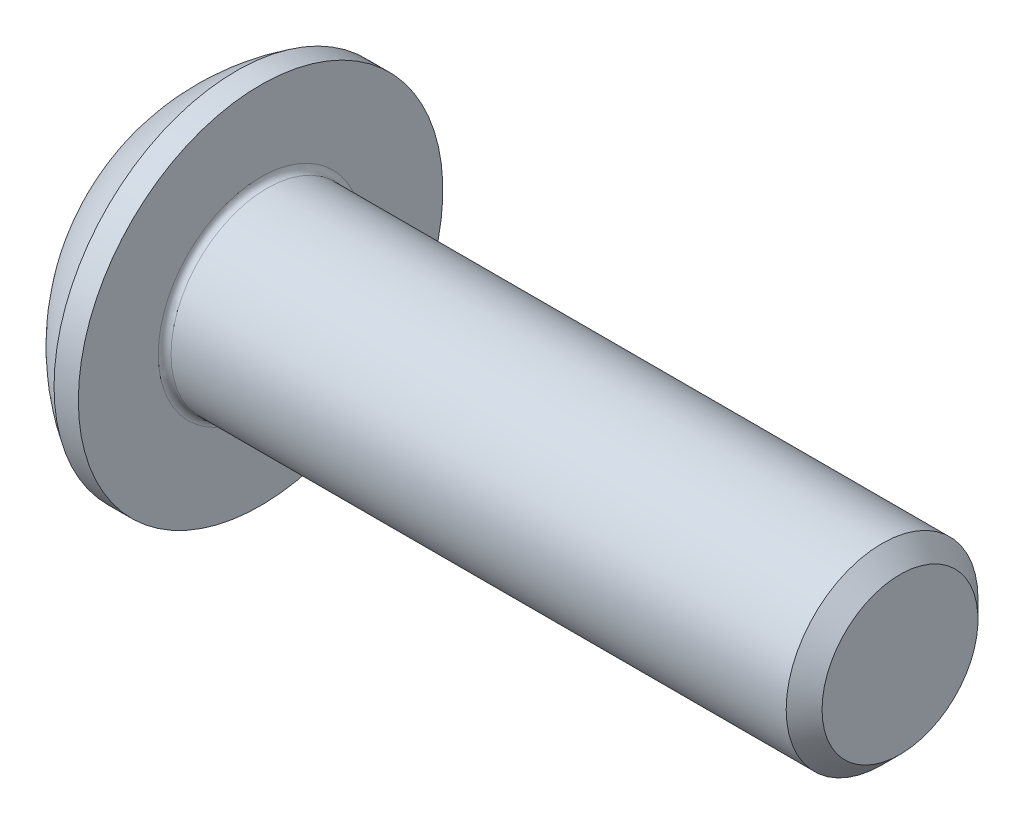
ISO-10303-21;
HEADER;
FILE_DESCRIPTION(('STEP AP214'),'2;1');
FILE_NAME('part.step','',(''),(''),'','','');
FILE_SCHEMA(('AUTOMOTIVE_DESIGN { 1 0 10303 214 1 1 1 1 }'));
ENDSEC;
DATA;
#1=APPLICATION_CONTEXT('core data for automotive mechanical design processes');
#2=APPLICATION_PROTOCOL_DEFINITION('international standard','automotive_design',2000,#1);
#3=PRODUCT_CONTEXT('',#1,'mechanical');
#4=PRODUCT('Part','Part','',(#3));
#5=PRODUCT_RELATED_PRODUCT_CATEGORY('part','',(#4));
#6=PRODUCT_DEFINITION_FORMATION('','',#4);
#7=PRODUCT_DEFINITION_CONTEXT('part definition',#1,'design');
#8=PRODUCT_DEFINITION('design','',#6,#7);
#9=PRODUCT_DEFINITION_SHAPE('','',#8);
#10=(LENGTH_UNIT() NAMED_UNIT(*) SI_UNIT(.MILLI.,.METRE.));
#11=(NAMED_UNIT(*) PLANE_ANGLE_UNIT() SI_UNIT($,.RADIAN.));
#12=(NAMED_UNIT(*) SI_UNIT($,.STERADIAN.) SOLID_ANGLE_UNIT());
#13=UNCERTAINTY_MEASURE_WITH_UNIT(LENGTH_MEASURE(1.E-05),#10,'distance_accuracy_value','');
#14=(GEOMETRIC_REPRESENTATION_CONTEXT(3) GLOBAL_UNCERTAINTY_ASSIGNED_CONTEXT((#13)) GLOBAL_UNIT_ASSIGNED_CONTEXT((#10,
#11,#12)) REPRESENTATION_CONTEXT('',''));
#15=CARTESIAN_POINT('',(0.,0.,0.));
#16=DIRECTION('',(0.,0.,1.));
#17=DIRECTION('',(1.,0.,0.));
#18=AXIS2_PLACEMENT_3D('',#15,#16,#17);
#19=CARTESIAN_POINT('',(1.03999999993221,0.,0.));
#20=DIRECTION('',(-1.,0.,0.));
#21=DIRECTION('',(0.,0.,1.));
#22=AXIS2_PLACEMENT_3D('',#19,#20,#21);
#23=CONICAL_SURFACE('',#22,1.0000000000332,1.04719755017927);
#24=CARTESIAN_POINT('',(1.61735027052146,0.,0.));
#25=VERTEX_POINT('',#24);
#26=VERTEX_LOOP('',#25);
#27=FACE_BOUND('',#26,.T.);
#28=CARTESIAN_POINT('',(1.03999999993221,0.,0.));
#29=DIRECTION('',(-1.,0.,0.));
#30=DIRECTION('',(0.,0.,1.));
#31=AXIS2_PLACEMENT_3D('',#28,#29,#30);
#32=CIRCLE('',#31,1.0000000000332);
#33=CARTESIAN_POINT('',(1.03999999995577,0.866025403798815,-0.500000000008298));
#34=VERTEX_POINT('',#33);
#35=CARTESIAN_POINT('',(1.0399999999611,0.,-0.999999999996476));
#36=VERTEX_POINT('',#35);
#37=EDGE_CURVE('E240',#34,#36,#32,.T.);
#38=ORIENTED_EDGE('',*,*,#37,.T.);
#39=CARTESIAN_POINT('',(1.03999999993221,0.,0.));
#40=DIRECTION('',(-1.,0.,0.));
#41=DIRECTION('',(0.,0.,1.));
#42=AXIS2_PLACEMENT_3D('',#39,#40,#41);
#43=CIRCLE('',#42,1.0000000000332);
#44=CARTESIAN_POINT('',(1.03999999995577,-0.866025403798814,-0.500000000008297));
#45=VERTEX_POINT('',#44);
#46=EDGE_CURVE('E220',#36,#45,#43,.T.);
#47=ORIENTED_EDGE('',*,*,#46,.T.);
#48=CARTESIAN_POINT('',(1.03999999993221,0.,0.));
#49=DIRECTION('',(-1.,0.,0.));
#50=DIRECTION('',(0.,0.,1.));
#51=AXIS2_PLACEMENT_3D('',#48,#49,#50);
#52=CIRCLE('',#51,1.0000000000332);
#53=CARTESIAN_POINT('',(1.03999999995577,-0.866025403798813,0.500000000008297));
#54=VERTEX_POINT('',#53);
#55=EDGE_CURVE('E242',#45,#54,#52,.T.);
#56=ORIENTED_EDGE('',*,*,#55,.T.);
#57=CARTESIAN_POINT('',(1.03999999993221,0.,0.));
#58=DIRECTION('',(-1.,0.,0.));
#59=DIRECTION('',(0.,0.,1.));
#60=AXIS2_PLACEMENT_3D('',#57,#58,#59);
#61=CIRCLE('',#60,1.0000000000332);
#62=CARTESIAN_POINT('',(1.03999999996091,0.,0.999999999996475));
#63=VERTEX_POINT('',#62);
#64=EDGE_CURVE('E244',#54,#63,#61,.T.);
#65=ORIENTED_EDGE('',*,*,#64,.T.);
#66=CARTESIAN_POINT('',(1.03999999993221,0.,0.));
#67=DIRECTION('',(-1.,0.,0.));
#68=DIRECTION('',(0.,0.,1.));
#69=AXIS2_PLACEMENT_3D('',#66,#67,#68);
#70=CIRCLE('',#69,1.0000000000332);
#71=CARTESIAN_POINT('',(1.03999999995577,0.866025403798815,0.500000000008297));
#72=VERTEX_POINT('',#71);
#73=EDGE_CURVE('E63',#63,#72,#70,.T.);
#74=ORIENTED_EDGE('',*,*,#73,.T.);
#75=CARTESIAN_POINT('',(1.03999999993221,0.,0.));
#76=DIRECTION('',(-1.,0.,0.));
#77=DIRECTION('',(0.,0.,1.));
#78=AXIS2_PLACEMENT_3D('',#75,#76,#77);
#79=CIRCLE('',#78,1.0000000000332);
#80=EDGE_CURVE('E69',#72,#34,#79,.T.);
#81=ORIENTED_EDGE('',*,*,#80,.T.);
#82=EDGE_LOOP('',(#38,#47,#56,#65,#74,#81));
#83=FACE_BOUND('',#82,.T.);
#84=ADVANCED_FACE('F16',(#27,#83),#23,.F.);
#85=CARTESIAN_POINT('',(1.04,-1.73205080756887,-1.));
#86=DIRECTION('',(1.,0.,0.));
#87=DIRECTION('',(0.,0.,-1.));
#88=AXIS2_PLACEMENT_3D('',#85,#86,#87);
#89=PLANE('',#88);
#90=DIRECTION('',(0.,-0.499999999999999,-0.866025403784439));
#91=VECTOR('',#90,1.);
#92=CARTESIAN_POINT('',(1.03999999997933,1.15470053837925,0.));
#93=LINE('',#92,#91);
#94=CARTESIAN_POINT('',(1.03999999998858,1.15470053837925,0.));
#95=VERTEX_POINT('',#94);
#96=EDGE_CURVE('E155',#34,#95,#93,.F.);
#97=ORIENTED_EDGE('',*,*,#96,.F.);
#98=ORIENTED_EDGE('',*,*,#80,.F.);
#99=DIRECTION('',(0.,0.499999999999998,-0.86602540378444));
#100=VECTOR('',#99,1.);
#101=CARTESIAN_POINT('',(1.03999999999094,0.577350269189628,1.));
#102=LINE('',#101,#100);
#103=EDGE_CURVE('E191',#95,#72,#102,.F.);
#104=ORIENTED_EDGE('',*,*,#103,.F.);
#105=EDGE_LOOP('',(#97,#98,#104));
#106=FACE_BOUND('',#105,.T.);
#107=ADVANCED_FACE('F263',(#106),#89,.F.);
#108=CARTESIAN_POINT('',(1.04,-1.73205080756887,-1.));
#109=DIRECTION('',(1.,0.,0.));
#110=DIRECTION('',(0.,0.,-1.));
#111=AXIS2_PLACEMENT_3D('',#108,#109,#110);
#112=PLANE('',#111);
#113=DIRECTION('',(0.,0.499999999999998,-0.86602540378444));
#114=VECTOR('',#113,1.);
#115=CARTESIAN_POINT('',(1.03999999997933,0.577350269189628,1.));
#116=LINE('',#115,#114);
#117=CARTESIAN_POINT('',(1.0399999999882,0.577350269189628,1.));
#118=VERTEX_POINT('',#117);
#119=EDGE_CURVE('E154',#72,#118,#116,.F.);
#120=ORIENTED_EDGE('',*,*,#119,.F.);
#121=ORIENTED_EDGE('',*,*,#73,.F.);
#122=DIRECTION('',(0.,1.,0.));
#123=VECTOR('',#122,1.);
#124=CARTESIAN_POINT('',(1.03999999999019,-0.577350269189625,0.999999999999998));
#125=LINE('',#124,#123);
#126=EDGE_CURVE('E172',#118,#63,#125,.F.);
#127=ORIENTED_EDGE('',*,*,#126,.F.);
#128=EDGE_LOOP('',(#120,#121,#127));
#129=FACE_BOUND('',#128,.T.);
#130=ADVANCED_FACE('F256',(#129),#112,.F.);
#131=CARTESIAN_POINT('',(1.04,-1.73205080756887,-1.));
#132=DIRECTION('',(1.,0.,0.));
#133=DIRECTION('',(0.,0.,-1.));
#134=AXIS2_PLACEMENT_3D('',#131,#132,#133);
#135=PLANE('',#134);
#136=DIRECTION('',(0.,1.,0.));
#137=VECTOR('',#136,1.);
#138=CARTESIAN_POINT('',(1.03999999998044,-0.577350269189625,0.999999999999998));
#139=LINE('',#138,#137);
#140=CARTESIAN_POINT('',(1.03999999998674,-0.577350269190324,0.999999999998966));
#141=VERTEX_POINT('',#140);
#142=EDGE_CURVE('E188',#63,#141,#139,.F.);
#143=ORIENTED_EDGE('',*,*,#142,.F.);
#144=ORIENTED_EDGE('',*,*,#64,.F.);
#145=DIRECTION('',(0.,0.499999999999999,0.866025403784439));
#146=VECTOR('',#145,1.);
#147=CARTESIAN_POINT('',(1.03999999998652,-1.15470053837925,0.));
#148=LINE('',#147,#146);
#149=EDGE_CURVE('E179',#141,#54,#148,.F.);
#150=ORIENTED_EDGE('',*,*,#149,.F.);
#151=EDGE_LOOP('',(#143,#144,#150));
#152=FACE_BOUND('',#151,.T.);
#153=ADVANCED_FACE('F252',(#152),#135,.F.);
#154=CARTESIAN_POINT('',(1.04,-1.73205080756887,-1.));
#155=DIRECTION('',(1.,0.,0.));
#156=DIRECTION('',(0.,0.,-1.));
#157=AXIS2_PLACEMENT_3D('',#154,#155,#156);
#158=PLANE('',#157);
#159=DIRECTION('',(0.,0.499999999999999,0.866025403784439));
#160=VECTOR('',#159,1.);
#161=CARTESIAN_POINT('',(1.03999999997933,-1.15470053837925,0.));
#162=LINE('',#161,#160);
#163=CARTESIAN_POINT('',(1.03999999998834,-1.15470053837925,0.));
#164=VERTEX_POINT('',#163);
#165=EDGE_CURVE('E169',#54,#164,#162,.F.);
#166=ORIENTED_EDGE('',*,*,#165,.F.);
#167=ORIENTED_EDGE('',*,*,#55,.F.);
#168=DIRECTION('',(0.,-0.499999999999997,0.86602540378444));
#169=VECTOR('',#168,1.);
#170=CARTESIAN_POINT('',(1.03999999999046,-0.577350269189626,-1.));
#171=LINE('',#170,#169);
#172=EDGE_CURVE('E158',#164,#45,#171,.F.);
#173=ORIENTED_EDGE('',*,*,#172,.F.);
#174=EDGE_LOOP('',(#166,#167,#173));
#175=FACE_BOUND('',#174,.T.);
#176=ADVANCED_FACE('F275',(#175),#158,.F.);
#177=CARTESIAN_POINT('',(1.04,-1.73205080756887,-1.));
#178=DIRECTION('',(1.,0.,0.));
#179=DIRECTION('',(0.,0.,-1.));
#180=AXIS2_PLACEMENT_3D('',#177,#178,#179);
#181=PLANE('',#180);
#182=DIRECTION('',(0.,1.,0.));
#183=VECTOR('',#182,1.);
#184=CARTESIAN_POINT('',(1.0399999999806,0.577350269189628,-1.));
#185=LINE('',#184,#183);
#186=CARTESIAN_POINT('',(1.03999999998564,0.577350269190404,-0.999999999998971));
#187=VERTEX_POINT('',#186);
#188=EDGE_CURVE('E128',#36,#187,#185,.T.);
#189=ORIENTED_EDGE('',*,*,#188,.F.);
#190=ORIENTED_EDGE('',*,*,#37,.F.);
#191=DIRECTION('',(0.,-0.499999999999999,-0.866025403784439));
#192=VECTOR('',#191,1.);
#193=CARTESIAN_POINT('',(1.03999999998602,1.15470053837925,0.));
#194=LINE('',#193,#192);
#195=EDGE_CURVE('E152',#187,#34,#194,.F.);
#196=ORIENTED_EDGE('',*,*,#195,.F.);
#197=EDGE_LOOP('',(#189,#190,#196));
#198=FACE_BOUND('',#197,.T.);
#199=ADVANCED_FACE('F266',(#198),#181,.F.);
#200=CARTESIAN_POINT('',(1.04,-1.73205080756887,-1.));
#201=DIRECTION('',(1.,0.,0.));
#202=DIRECTION('',(0.,0.,-1.));
#203=AXIS2_PLACEMENT_3D('',#200,#201,#202);
#204=PLANE('',#203);
#205=DIRECTION('',(0.,-0.499999999999997,0.86602540378444));
#206=VECTOR('',#205,1.);
#207=CARTESIAN_POINT('',(1.03999999997933,-0.577350269189626,-1.));
#208=LINE('',#207,#206);
#209=CARTESIAN_POINT('',(1.03999999998858,-0.577350269189626,-1.));
#210=VERTEX_POINT('',#209);
#211=EDGE_CURVE('E166',#45,#210,#208,.F.);
#212=ORIENTED_EDGE('',*,*,#211,.F.);
#213=ORIENTED_EDGE('',*,*,#46,.F.);
#214=DIRECTION('',(0.,1.,0.));
#215=VECTOR('',#214,1.);
#216=CARTESIAN_POINT('',(1.03999999999094,0.577350269189628,-1.));
#217=LINE('',#216,#215);
#218=EDGE_CURVE('E118',#210,#36,#217,.T.);
#219=ORIENTED_EDGE('',*,*,#218,.F.);
#220=EDGE_LOOP('',(#212,#213,#219));
#221=FACE_BOUND('',#220,.T.);
#222=ADVANCED_FACE('F271',(#221),#204,.F.);
#223=CARTESIAN_POINT('',(1.04,1.15470053837925,0.));
#224=DIRECTION('',(0.,-0.866025403784439,0.499999999999999));
#225=DIRECTION('',(0.,-0.499999999999999,-0.866025403784439));
#226=AXIS2_PLACEMENT_3D('',#223,#224,#225);
#227=PLANE('',#226);
#228=DIRECTION('',(1.,0.,0.));
#229=VECTOR('',#228,1.);
#230=CARTESIAN_POINT('',(1.04,0.577350269189901,-1.));
#231=LINE('',#230,#229);
#232=CARTESIAN_POINT('',(0.,0.577350269189659,-1.));
#233=VERTEX_POINT('',#232);
#234=EDGE_CURVE('E109',#187,#233,#231,.F.);
#235=ORIENTED_EDGE('',*,*,#234,.F.);
#236=ORIENTED_EDGE('',*,*,#195,.T.);
#237=ORIENTED_EDGE('',*,*,#96,.T.);
#238=DIRECTION('',(1.,0.,0.));
#239=VECTOR('',#238,1.);
#240=CARTESIAN_POINT('',(1.04,1.15470053837925,0.));
#241=LINE('',#240,#239);
#242=CARTESIAN_POINT('',(0.,1.15470053837925,0.));
#243=VERTEX_POINT('',#242);
#244=EDGE_CURVE('E112',#243,#95,#241,.T.);
#245=ORIENTED_EDGE('',*,*,#244,.F.);
#246=DIRECTION('',(0.,0.500000000000091,0.866025403784386));
#247=VECTOR('',#246,1.);
#248=CARTESIAN_POINT('',(0.,0.577350269189518,-0.999999999999946));
#249=LINE('',#248,#247);
#250=EDGE_CURVE('E105',#233,#243,#249,.T.);
#251=ORIENTED_EDGE('',*,*,#250,.F.);
#252=EDGE_LOOP('',(#235,#236,#237,#245,#251));
#253=FACE_BOUND('',#252,.T.);
#254=ADVANCED_FACE('F107',(#253),#227,.T.);
#255=CARTESIAN_POINT('',(1.04,0.577350269189628,1.));
#256=DIRECTION('',(0.,-0.86602540378444,-0.499999999999998));
#257=DIRECTION('',(0.,0.499999999999998,-0.86602540378444));
#258=AXIS2_PLACEMENT_3D('',#255,#256,#257);
#259=PLANE('',#258);
#260=ORIENTED_EDGE('',*,*,#244,.T.);
#261=ORIENTED_EDGE('',*,*,#103,.T.);
#262=ORIENTED_EDGE('',*,*,#119,.T.);
#263=DIRECTION('',(1.,0.,0.));
#264=VECTOR('',#263,1.);
#265=CARTESIAN_POINT('',(1.04,0.577350269189628,1.));
#266=LINE('',#265,#264);
#267=CARTESIAN_POINT('',(0.,0.577350269189628,1.));
#268=VERTEX_POINT('',#267);
#269=EDGE_CURVE('E190',#268,#118,#266,.T.);
#270=ORIENTED_EDGE('',*,*,#269,.F.);
#271=DIRECTION('',(0.,-0.499999999999998,0.86602540378444));
#272=VECTOR('',#271,1.);
#273=CARTESIAN_POINT('',(0.,1.15470053837925,0.));
#274=LINE('',#273,#272);
#275=EDGE_CURVE('E117',#243,#268,#274,.T.);
#276=ORIENTED_EDGE('',*,*,#275,.F.);
#277=EDGE_LOOP('',(#260,#261,#262,#270,#276));
#278=FACE_BOUND('',#277,.T.);
#279=ADVANCED_FACE('F260',(#278),#259,.T.);
#280=CARTESIAN_POINT('',(1.04,-0.577350269189625,0.999999999999998));
#281=DIRECTION('',(0.,0.,-1.));
#282=DIRECTION('',(0.,1.,0.));
#283=AXIS2_PLACEMENT_3D('',#280,#281,#282);
#284=PLANE('',#283);
#285=ORIENTED_EDGE('',*,*,#269,.T.);
#286=ORIENTED_EDGE('',*,*,#126,.T.);
#287=ORIENTED_EDGE('',*,*,#142,.T.);
#288=DIRECTION('',(1.,0.,0.));
#289=VECTOR('',#288,1.);
#290=CARTESIAN_POINT('',(1.04,-0.577350269189651,0.999999999999953));
#291=LINE('',#290,#289);
#292=CARTESIAN_POINT('',(0.,-0.577350269189636,0.999999999999927));
#293=VERTEX_POINT('',#292);
#294=EDGE_CURVE('E171',#293,#141,#291,.T.);
#295=ORIENTED_EDGE('',*,*,#294,.F.);
#296=DIRECTION('',(0.,1.,0.));
#297=VECTOR('',#296,1.);
#298=CARTESIAN_POINT('',(0.,0.,1.));
#299=LINE('',#298,#297);
#300=EDGE_CURVE('E176',#268,#293,#299,.F.);
#301=ORIENTED_EDGE('',*,*,#300,.F.);
#302=EDGE_LOOP('',(#285,#286,#287,#295,#301));
#303=FACE_BOUND('',#302,.T.);
#304=ADVANCED_FACE('F257',(#303),#284,.T.);
#305=CARTESIAN_POINT('',(1.04,-1.15470053837925,0.));
#306=DIRECTION('',(0.,0.866025403784439,-0.499999999999999));
#307=DIRECTION('',(0.,0.499999999999999,0.866025403784439));
#308=AXIS2_PLACEMENT_3D('',#305,#306,#307);
#309=PLANE('',#308);
#310=ORIENTED_EDGE('',*,*,#294,.T.);
#311=ORIENTED_EDGE('',*,*,#149,.T.);
#312=ORIENTED_EDGE('',*,*,#165,.T.);
#313=DIRECTION('',(1.,0.,0.));
#314=VECTOR('',#313,1.);
#315=CARTESIAN_POINT('',(1.04,-1.15470053837925,0.));
#316=LINE('',#315,#314);
#317=CARTESIAN_POINT('',(0.,-1.15470053837925,0.));
#318=VERTEX_POINT('',#317);
#319=EDGE_CURVE('E161',#318,#164,#316,.T.);
#320=ORIENTED_EDGE('',*,*,#319,.F.);
#321=DIRECTION('',(0.,-0.500000000000039,-0.866025403784416));
#322=VECTOR('',#321,1.);
#323=CARTESIAN_POINT('',(0.,-0.577350269189606,0.999999999999926));
#324=LINE('',#323,#322);
#325=EDGE_CURVE('E140',#293,#318,#324,.T.);
#326=ORIENTED_EDGE('',*,*,#325,.F.);
#327=EDGE_LOOP('',(#310,#311,#312,#320,#326));
#328=FACE_BOUND('',#327,.T.);
#329=ADVANCED_FACE('F279',(#328),#309,.T.);
#330=CARTESIAN_POINT('',(1.04,-0.577350269189626,-1.));
#331=DIRECTION('',(0.,0.86602540378444,0.499999999999997));
#332=DIRECTION('',(0.,-0.499999999999997,0.86602540378444));
#333=AXIS2_PLACEMENT_3D('',#330,#331,#332);
#334=PLANE('',#333);
#335=ORIENTED_EDGE('',*,*,#319,.T.);
#336=ORIENTED_EDGE('',*,*,#172,.T.);
#337=ORIENTED_EDGE('',*,*,#211,.T.);
#338=DIRECTION('',(1.,0.,0.));
#339=VECTOR('',#338,1.);
#340=CARTESIAN_POINT('',(1.04,-0.577350269189626,-1.));
#341=LINE('',#340,#339);
#342=CARTESIAN_POINT('',(0.,-0.577350269189626,-1.));
#343=VERTEX_POINT('',#342);
#344=EDGE_CURVE('E129',#343,#210,#341,.T.);
#345=ORIENTED_EDGE('',*,*,#344,.F.);
#346=DIRECTION('',(0.,0.499999999999997,-0.86602540378444));
#347=VECTOR('',#346,1.);
#348=CARTESIAN_POINT('',(0.,-1.15470053837925,0.));
#349=LINE('',#348,#347);
#350=EDGE_CURVE('E134',#318,#343,#349,.T.);
#351=ORIENTED_EDGE('',*,*,#350,.F.);
#352=EDGE_LOOP('',(#335,#336,#337,#345,#351));
#353=FACE_BOUND('',#352,.T.);
#354=ADVANCED_FACE('F276',(#353),#334,.T.);
#355=CARTESIAN_POINT('',(1.04,0.577350269189628,-1.));
#356=DIRECTION('',(0.,0.,1.));
#357=DIRECTION('',(1.,0.,0.));
#358=AXIS2_PLACEMENT_3D('',#355,#356,#357);
#359=PLANE('',#358);
#360=ORIENTED_EDGE('',*,*,#344,.T.);
#361=ORIENTED_EDGE('',*,*,#218,.T.);
#362=ORIENTED_EDGE('',*,*,#188,.T.);
#363=ORIENTED_EDGE('',*,*,#234,.T.);
#364=DIRECTION('',(0.,1.,0.));
#365=VECTOR('',#364,1.);
#366=CARTESIAN_POINT('',(0.,0.,-1.));
#367=LINE('',#366,#365);
#368=EDGE_CURVE('E124',#343,#233,#367,.T.);
#369=ORIENTED_EDGE('',*,*,#368,.F.);
#370=EDGE_LOOP('',(#360,#361,#362,#363,#369));
#371=FACE_BOUND('',#370,.T.);
#372=ADVANCED_FACE('F123',(#371),#359,.T.);
#373=CARTESIAN_POINT('',(0.,0.,0.));
#374=DIRECTION('',(-1.,0.,0.));
#375=DIRECTION('',(0.,0.,1.));
#376=AXIS2_PLACEMENT_3D('',#373,#374,#375);
#377=PLANE('',#376);
#378=CARTESIAN_POINT('',(0.,0.,0.));
#379=DIRECTION('',(-1.,0.,0.));
#380=DIRECTION('',(0.,0.,1.));
#381=AXIS2_PLACEMENT_3D('',#378,#379,#380);
#382=CIRCLE('',#381,1.42500000000001);
#383=CARTESIAN_POINT('',(0.,0.,1.42500000000001));
#384=VERTEX_POINT('',#383);
#385=EDGE_CURVE('E135',#384,#384,#382,.F.);
#386=ORIENTED_EDGE('',*,*,#385,.F.);
#387=EDGE_LOOP('',(#386));
#388=FACE_BOUND('',#387,.T.);
#389=ORIENTED_EDGE('',*,*,#350,.T.);
#390=ORIENTED_EDGE('',*,*,#368,.T.);
#391=ORIENTED_EDGE('',*,*,#250,.T.);
#392=ORIENTED_EDGE('',*,*,#275,.T.);
#393=ORIENTED_EDGE('',*,*,#300,.T.);
#394=ORIENTED_EDGE('',*,*,#325,.T.);
#395=EDGE_LOOP('',(#389,#390,#391,#392,#393,#394));
#396=FACE_BOUND('',#395,.T.);
#397=ADVANCED_FACE('F131',(#388,#396),#377,.T.);
#398=CARTESIAN_POINT('',(3.03337598425198,0.,0.));
#399=DIRECTION('',(-0.50571686595863,-0.00085757338909468,-0.862699087777925));
#400=DIRECTION('',(0.122328188499024,0.989823987826749,-0.0726931043586705));
#401=AXIS2_PLACEMENT_3D('',#398,#399,#400);
#402=SPHERICAL_SURFACE('',#401,3.3514168439388);
#403=CARTESIAN_POINT('',(3.03337598425198,0.,0.));
#404=DIRECTION('',(-1.,0.,0.));
#405=DIRECTION('',(0.,0.,1.));
#406=AXIS2_PLACEMENT_3D('',#403,#404,#405);
#407=SPHERICAL_SURFACE('',#406,3.3514168439388);
#408=ORIENTED_EDGE('',*,*,#385,.T.);
#409=EDGE_LOOP('',(#408));
#410=FACE_BOUND('',#409,.T.);
#411=CARTESIAN_POINT('',(1.27,0.,0.));
#412=DIRECTION('',(-1.,0.,0.));
#413=DIRECTION('',(0.,0.,1.));
#414=AXIS2_PLACEMENT_3D('',#411,#412,#413);
#415=CIRCLE('',#414,2.85);
#416=CARTESIAN_POINT('',(1.27,0.,2.85));
#417=VERTEX_POINT('',#416);
#418=EDGE_CURVE('E138',#417,#417,#415,.F.);
#419=ORIENTED_EDGE('',*,*,#418,.F.);
#420=EDGE_LOOP('',(#419));
#421=FACE_BOUND('',#420,.T.);
#422=ADVANCED_FACE('F331',(#410,#421),#407,.T.);
#423=CARTESIAN_POINT('',(0.,0.,0.));
#424=DIRECTION('',(-1.,0.,0.));
#425=DIRECTION('',(0.,0.,1.));
#426=AXIS2_PLACEMENT_3D('',#423,#424,#425);
#427=CYLINDRICAL_SURFACE('',#426,2.85);
#428=ORIENTED_EDGE('',*,*,#418,.T.);
#429=EDGE_LOOP('',(#428));
#430=FACE_BOUND('',#429,.T.);
#431=CARTESIAN_POINT('',(1.65,0.,0.));
#432=DIRECTION('',(-1.,0.,0.));
#433=DIRECTION('',(0.,0.,1.));
#434=AXIS2_PLACEMENT_3D('',#431,#432,#433);
#435=CIRCLE('',#434,2.85);
#436=CARTESIAN_POINT('',(1.65,0.,2.85));
#437=VERTEX_POINT('',#436);
#438=EDGE_CURVE('E234',#437,#437,#435,.T.);
#439=ORIENTED_EDGE('',*,*,#438,.T.);
#440=EDGE_LOOP('',(#439));
#441=FACE_BOUND('',#440,.T.);
#442=ADVANCED_FACE('F327',(#430,#441),#427,.T.);
#443=CARTESIAN_POINT('',(11.65,0.,0.));
#444=DIRECTION('',(-1.,0.,0.));
#445=DIRECTION('',(0.,0.,1.));
#446=AXIS2_PLACEMENT_3D('',#443,#444,#445);
#447=PLANE('',#446);
#448=CARTESIAN_POINT('',(11.6500000000315,0.,0.));
#449=DIRECTION('',(-1.,0.,0.));
#450=DIRECTION('',(0.,0.,1.));
#451=AXIS2_PLACEMENT_3D('',#448,#449,#450);
#452=CIRCLE('',#451,1.2194999999906);
#453=CARTESIAN_POINT('',(11.6500000000315,0.,1.2194999999906));
#454=VERTEX_POINT('',#453);
#455=EDGE_CURVE('E231',#454,#454,#452,.T.);
#456=ORIENTED_EDGE('',*,*,#455,.F.);
#457=EDGE_LOOP('',(#456));
#458=FACE_BOUND('',#457,.T.);
#459=ADVANCED_FACE('F307',(#458),#447,.F.);
#460=CARTESIAN_POINT('',(1.65,1.49999999999999,0.));
#461=DIRECTION('',(-1.,0.,0.));
#462=DIRECTION('',(0.,0.,1.));
#463=AXIS2_PLACEMENT_3D('',#460,#461,#462);
#464=PLANE('',#463);
#465=CARTESIAN_POINT('',(1.65,0.,0.));
#466=DIRECTION('',(-1.,0.,0.));
#467=DIRECTION('',(0.,-1.,0.));
#468=AXIS2_PLACEMENT_3D('',#465,#466,#467);
#469=CIRCLE('',#468,1.6);
#470=CARTESIAN_POINT('',(1.65,0.,-1.60000000000131));
#471=VERTEX_POINT('',#470);
#472=CARTESIAN_POINT('',(1.65,-1.6,-9.86750431528086E-12));
#473=VERTEX_POINT('',#472);
#474=EDGE_CURVE('E227',#471,#473,#469,.T.);
#475=ORIENTED_EDGE('',*,*,#474,.T.);
#476=CARTESIAN_POINT('',(1.65,0.,1.60000000000086));
#477=CARTESIAN_POINT('',(1.65,-0.303101665347798,1.60000000000086));
#478=CARTESIAN_POINT('',(1.65,-0.588951535298992,1.48766128169989));
#479=CARTESIAN_POINT('',(1.65,-0.89364479729935,1.36791712882024));
#480=CARTESIAN_POINT('',(1.65,-1.13137084989847,1.13137084989848));
#481=CARTESIAN_POINT('',(1.65,-1.36346039104805,0.900433109859648));
#482=CARTESIAN_POINT('',(1.65,-1.48766128169988,0.588951535299001));
#483=CARTESIAN_POINT('',(1.65,-1.59980251672273,0.30771419251689));
#484=CARTESIAN_POINT('',(1.65,-1.60000000000061,-4.93380604210292E-11));
#485=B_SPLINE_CURVE_WITH_KNOTS('',2,(#476,#477,#478,#479,#480,#481,#482,#483,#484),
.UNSPECIFIED.,.F.,.F.,(3,2,2,2,3),(0.,0.25,0.5,0.75,1.),.UNSPECIFIED.);
#486=CARTESIAN_POINT('',(1.65,0.,1.60000000000086));
#487=VERTEX_POINT('',#486);
#488=EDGE_CURVE('E226',#473,#487,#485,.F.);
#489=ORIENTED_EDGE('',*,*,#488,.T.);
#490=CARTESIAN_POINT('',(1.65,0.,0.));
#491=DIRECTION('',(-1.,0.,0.));
#492=DIRECTION('',(0.,-1.,0.));
#493=AXIS2_PLACEMENT_3D('',#490,#491,#492);
#494=CIRCLE('',#493,1.6);
#495=CARTESIAN_POINT('',(1.65,1.60000000000066,1.36410318277524E-09));
#496=VERTEX_POINT('',#495);
#497=EDGE_CURVE('E33',#487,#496,#494,.T.);
#498=ORIENTED_EDGE('',*,*,#497,.T.);
#499=CARTESIAN_POINT('',(1.65,0.,-1.60000000000131));
#500=CARTESIAN_POINT('',(1.65,0.303101665345261,-1.60000000000131));
#501=CARTESIAN_POINT('',(1.65,0.588951535298991,-1.48766128169989));
#502=CARTESIAN_POINT('',(1.65,0.893644797298631,-1.36791712882111));
#503=CARTESIAN_POINT('',(1.65,1.13137084989847,-1.13137084989848));
#504=CARTESIAN_POINT('',(1.65,1.36346039104803,-0.900433109859518));
#505=CARTESIAN_POINT('',(1.65,1.48766128169988,-0.588951535298997));
#506=CARTESIAN_POINT('',(1.65,1.59980251672472,-0.307714192512073));
#507=CARTESIAN_POINT('',(1.65,1.60000000000131,2.72820598590997E-09));
#508=B_SPLINE_CURVE_WITH_KNOTS('',2,(#499,#500,#501,#502,#503,#504,#505,#506,#507),
.UNSPECIFIED.,.F.,.F.,(3,2,2,2,3),(0.,0.25,0.5,0.75,1.),.UNSPECIFIED.);
#509=EDGE_CURVE('E230',#496,#471,#508,.F.);
#510=ORIENTED_EDGE('',*,*,#509,.T.);
#511=EDGE_LOOP('',(#475,#489,#498,#510));
#512=FACE_BOUND('',#511,.T.);
#513=ORIENTED_EDGE('',*,*,#438,.F.);
#514=EDGE_LOOP('',(#513));
#515=FACE_BOUND('',#514,.T.);
#516=ADVANCED_FACE('F302',(#512,#515),#464,.F.);
#517=CARTESIAN_POINT('',(11.3695000000575,0.,0.));
#518=DIRECTION('',(-1.,0.,0.));
#519=DIRECTION('',(0.,0.,1.));
#520=AXIS2_PLACEMENT_3D('',#517,#518,#519);
#521=CONICAL_SURFACE('',#520,1.49999999996453,0.785398163397448);
#522=CARTESIAN_POINT('',(11.3695,0.,0.));
#523=DIRECTION('',(-1.,0.,0.));
#524=DIRECTION('',(0.,0.,1.));
#525=AXIS2_PLACEMENT_3D('',#522,#523,#524);
#526=CIRCLE('',#525,1.5);
#527=CARTESIAN_POINT('',(11.3695,0.,1.5));
#528=VERTEX_POINT('',#527);
#529=EDGE_CURVE('E25',#528,#528,#526,.T.);
#530=ORIENTED_EDGE('',*,*,#529,.F.);
#531=EDGE_LOOP('',(#530));
#532=FACE_BOUND('',#531,.T.);
#533=ORIENTED_EDGE('',*,*,#455,.T.);
#534=EDGE_LOOP('',(#533));
#535=FACE_BOUND('',#534,.T.);
#536=ADVANCED_FACE('F296',(#532,#535),#521,.T.);
#537=CARTESIAN_POINT('',(1.75,0.,0.));
#538=DIRECTION('',(-1.,0.,0.));
#539=DIRECTION('',(0.,-1.,0.));
#540=AXIS2_PLACEMENT_3D('',#537,#538,#539);
#541=TOROIDAL_SURFACE('',#540,1.6,0.0999999999999992);
#542=ORIENTED_EDGE('',*,*,#488,.F.);
#543=ORIENTED_EDGE('',*,*,#474,.F.);
#544=ORIENTED_EDGE('',*,*,#509,.F.);
#545=ORIENTED_EDGE('',*,*,#497,.F.);
#546=EDGE_LOOP('',(#542,#543,#544,#545));
#547=FACE_BOUND('',#546,.T.);
#548=CARTESIAN_POINT('',(1.75,0.,0.));
#549=DIRECTION('',(-1.,0.,0.));
#550=DIRECTION('',(0.,0.,1.));
#551=AXIS2_PLACEMENT_3D('',#548,#549,#550);
#552=CIRCLE('',#551,1.5);
#553=CARTESIAN_POINT('',(1.75,0.,1.5));
#554=VERTEX_POINT('',#553);
#555=EDGE_CURVE('E11',#554,#554,#552,.F.);
#556=ORIENTED_EDGE('',*,*,#555,.F.);
#557=EDGE_LOOP('',(#556));
#558=FACE_BOUND('',#557,.T.);
#559=ADVANCED_FACE('F18',(#547,#558),#541,.F.);
#560=CARTESIAN_POINT('',(0.,0.,0.));
#561=DIRECTION('',(-1.,0.,0.));
#562=DIRECTION('',(0.,0.,1.));
#563=AXIS2_PLACEMENT_3D('',#560,#561,#562);
#564=CYLINDRICAL_SURFACE('',#563,1.5);
#565=ORIENTED_EDGE('',*,*,#555,.T.);
#566=EDGE_LOOP('',(#565));
#567=FACE_BOUND('',#566,.T.);
#568=ORIENTED_EDGE('',*,*,#529,.T.);
#569=EDGE_LOOP('',(#568));
#570=FACE_BOUND('',#569,.T.);
#571=ADVANCED_FACE('F289',(#567,#570),#564,.T.);
#572=CLOSED_SHELL('',(#84,#107,#130,#153,#176,#199,#222,#254,#279,#304,#329,#354,#372,#397,#422,
#442,#459,#516,#536,#559,#571));
#573=MANIFOLD_SOLID_BREP('B1',#572);
#574=ADVANCED_BREP_SHAPE_REPRESENTATION('',(#18,#573),#14);
#575=SHAPE_DEFINITION_REPRESENTATION(#9,#574);
ENDSEC;
END-ISO-10303-21;
